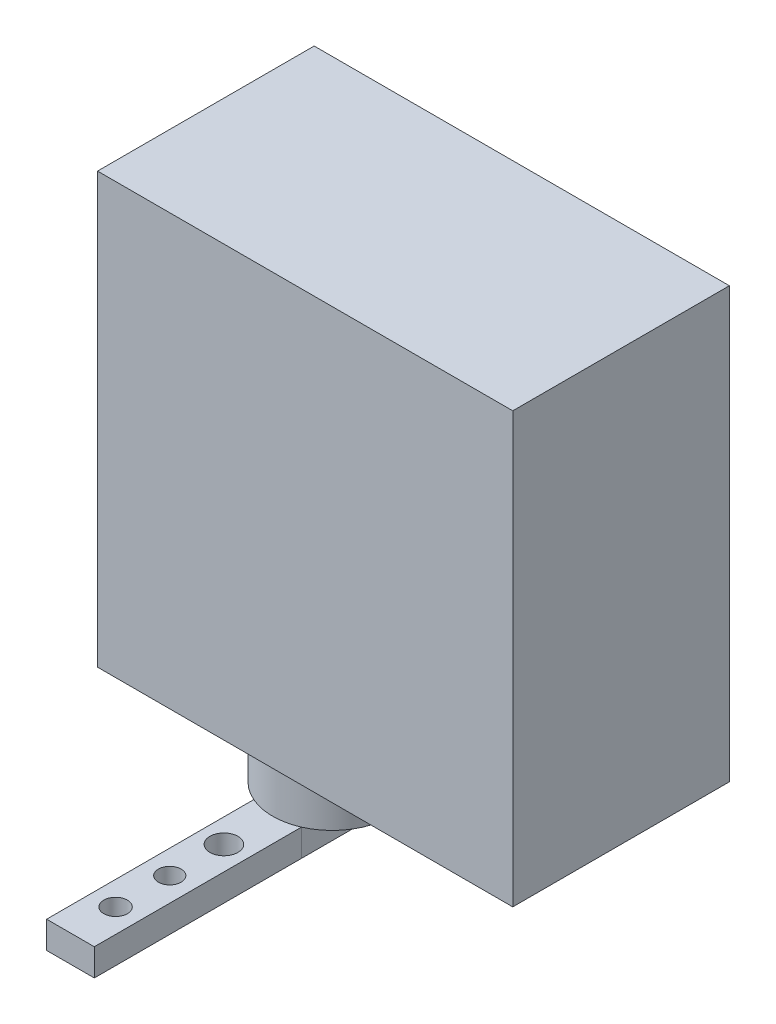
ISO-10303-21;
HEADER;
FILE_DESCRIPTION(('STEP AP214'),'2;1');
FILE_NAME('part.step','',(''),(''),'','','');
FILE_SCHEMA(('AUTOMOTIVE_DESIGN { 1 0 10303 214 1 1 1 1 }'));
ENDSEC;
DATA;
#1=APPLICATION_CONTEXT('core data for automotive mechanical design processes');
#2=APPLICATION_PROTOCOL_DEFINITION('international standard','automotive_design',2000,#1);
#3=PRODUCT_CONTEXT('',#1,'mechanical');
#4=PRODUCT('Part','Part','',(#3));
#5=PRODUCT_RELATED_PRODUCT_CATEGORY('part','',(#4));
#6=PRODUCT_DEFINITION_FORMATION('','',#4);
#7=PRODUCT_DEFINITION_CONTEXT('part definition',#1,'design');
#8=PRODUCT_DEFINITION('design','',#6,#7);
#9=PRODUCT_DEFINITION_SHAPE('','',#8);
#10=(LENGTH_UNIT() NAMED_UNIT(*) SI_UNIT(.MILLI.,.METRE.));
#11=(NAMED_UNIT(*) PLANE_ANGLE_UNIT() SI_UNIT($,.RADIAN.));
#12=(NAMED_UNIT(*) SI_UNIT($,.STERADIAN.) SOLID_ANGLE_UNIT());
#13=UNCERTAINTY_MEASURE_WITH_UNIT(LENGTH_MEASURE(1.E-05),#10,'distance_accuracy_value','');
#14=(GEOMETRIC_REPRESENTATION_CONTEXT(3) GLOBAL_UNCERTAINTY_ASSIGNED_CONTEXT((#13)) GLOBAL_UNIT_ASSIGNED_CONTEXT((#10,
#11,#12)) REPRESENTATION_CONTEXT('',''));
#15=CARTESIAN_POINT('',(0.,0.,0.));
#16=DIRECTION('',(0.,0.,1.));
#17=DIRECTION('',(1.,0.,0.));
#18=AXIS2_PLACEMENT_3D('',#15,#16,#17);
#19=CARTESIAN_POINT('',(6.99999999999999,-6.5,-6.));
#20=DIRECTION('',(0.,1.,0.));
#21=DIRECTION('',(0.,0.,1.));
#22=AXIS2_PLACEMENT_3D('',#19,#20,#21);
#23=CYLINDRICAL_SURFACE('',#22,3.30179450317333);
#24=CARTESIAN_POINT('',(6.99999999999999,-5.,-6.));
#25=DIRECTION('',(0.,-1.,0.));
#26=DIRECTION('',(0.,0.,-1.));
#27=AXIS2_PLACEMENT_3D('',#24,#25,#26);
#28=CIRCLE('',#27,3.30179450317333);
#29=CARTESIAN_POINT('',(5.67902558880153,-5.,-9.02603264128867));
#30=VERTEX_POINT('',#29);
#31=CARTESIAN_POINT('',(8.32097441119846,-5.,-9.02603264128867));
#32=VERTEX_POINT('',#31);
#33=EDGE_CURVE('E173',#30,#32,#28,.T.);
#34=ORIENTED_EDGE('',*,*,#33,.F.);
#35=DIRECTION('',(0.,1.,0.));
#36=VECTOR('',#35,1.);
#37=CARTESIAN_POINT('',(5.67902558880153,-6.5,-9.02603264128867));
#38=LINE('',#37,#36);
#39=CARTESIAN_POINT('',(5.67902558880153,-6.5,-9.02603264128867));
#40=VERTEX_POINT('',#39);
#41=EDGE_CURVE('E13',#40,#30,#38,.T.);
#42=ORIENTED_EDGE('',*,*,#41,.F.);
#43=CARTESIAN_POINT('',(6.99999999999999,-6.5,-6.));
#44=DIRECTION('',(0.,-1.,0.));
#45=DIRECTION('',(0.,0.,-1.));
#46=AXIS2_PLACEMENT_3D('',#43,#44,#45);
#47=CIRCLE('',#46,3.30179450317333);
#48=CARTESIAN_POINT('',(8.32097441119846,-6.5,-9.02603264128867));
#49=VERTEX_POINT('',#48);
#50=EDGE_CURVE('E157',#40,#49,#47,.T.);
#51=ORIENTED_EDGE('',*,*,#50,.T.);
#52=DIRECTION('',(0.,1.,0.));
#53=VECTOR('',#52,1.);
#54=CARTESIAN_POINT('',(8.32097441119846,-6.5,-9.02603264128867));
#55=LINE('',#54,#53);
#56=EDGE_CURVE('E135',#49,#32,#55,.T.);
#57=ORIENTED_EDGE('',*,*,#56,.T.);
#58=EDGE_LOOP('',(#34,#42,#51,#57));
#59=FACE_BOUND('',#58,.T.);
#60=ADVANCED_FACE('F95',(#59),#23,.F.);
#61=CARTESIAN_POINT('',(5.67902558880153,-6.5,0.));
#62=DIRECTION('',(-1.,0.,0.));
#63=DIRECTION('',(0.,0.,1.));
#64=AXIS2_PLACEMENT_3D('',#61,#62,#63);
#65=PLANE('',#64);
#66=DIRECTION('',(0.,0.,1.));
#67=VECTOR('',#66,1.);
#68=CARTESIAN_POINT('',(5.67902558880153,-5.,0.));
#69=LINE('',#68,#67);
#70=CARTESIAN_POINT('',(5.67902558880153,-5.,-20.5));
#71=VERTEX_POINT('',#70);
#72=EDGE_CURVE('E147',#71,#30,#69,.T.);
#73=ORIENTED_EDGE('',*,*,#72,.F.);
#74=DIRECTION('',(0.,1.,0.));
#75=VECTOR('',#74,1.);
#76=CARTESIAN_POINT('',(5.67902558880153,-6.5,-20.5));
#77=LINE('',#76,#75);
#78=CARTESIAN_POINT('',(5.67902558880153,-6.5,-20.5));
#79=VERTEX_POINT('',#78);
#80=EDGE_CURVE('E104',#79,#71,#77,.T.);
#81=ORIENTED_EDGE('',*,*,#80,.F.);
#82=DIRECTION('',(0.,0.,1.));
#83=VECTOR('',#82,1.);
#84=CARTESIAN_POINT('',(5.67902558880153,-6.5,0.));
#85=LINE('',#84,#83);
#86=EDGE_CURVE('E145',#79,#40,#85,.T.);
#87=ORIENTED_EDGE('',*,*,#86,.T.);
#88=ORIENTED_EDGE('',*,*,#41,.T.);
#89=EDGE_LOOP('',(#73,#81,#87,#88));
#90=FACE_BOUND('',#89,.T.);
#91=ADVANCED_FACE('F143',(#90),#65,.T.);
#92=CARTESIAN_POINT('',(0.,-6.5,-20.5));
#93=DIRECTION('',(0.,0.,1.));
#94=DIRECTION('',(1.,0.,0.));
#95=AXIS2_PLACEMENT_3D('',#92,#93,#94);
#96=PLANE('',#95);
#97=DIRECTION('',(1.,0.,0.));
#98=VECTOR('',#97,1.);
#99=CARTESIAN_POINT('',(0.,-5.,-20.5));
#100=LINE('',#99,#98);
#101=CARTESIAN_POINT('',(8.32097441119846,-5.,-20.5));
#102=VERTEX_POINT('',#101);
#103=EDGE_CURVE('E176',#71,#102,#100,.T.);
#104=ORIENTED_EDGE('',*,*,#103,.T.);
#105=DIRECTION('',(0.,1.,0.));
#106=VECTOR('',#105,1.);
#107=CARTESIAN_POINT('',(8.32097441119846,-6.5,-20.5));
#108=LINE('',#107,#106);
#109=CARTESIAN_POINT('',(8.32097441119846,-6.5,-20.5));
#110=VERTEX_POINT('',#109);
#111=EDGE_CURVE('E150',#110,#102,#108,.T.);
#112=ORIENTED_EDGE('',*,*,#111,.F.);
#113=DIRECTION('',(1.,0.,0.));
#114=VECTOR('',#113,1.);
#115=CARTESIAN_POINT('',(0.,-6.5,-20.5));
#116=LINE('',#115,#114);
#117=EDGE_CURVE('E152',#79,#110,#116,.T.);
#118=ORIENTED_EDGE('',*,*,#117,.F.);
#119=ORIENTED_EDGE('',*,*,#80,.T.);
#120=EDGE_LOOP('',(#104,#112,#118,#119));
#121=FACE_BOUND('',#120,.T.);
#122=ADVANCED_FACE('F153',(#121),#96,.F.);
#123=CARTESIAN_POINT('',(6.99999999999999,-6.5,-18.));
#124=DIRECTION('',(0.,1.,0.));
#125=DIRECTION('',(0.,0.,1.));
#126=AXIS2_PLACEMENT_3D('',#123,#124,#125);
#127=CYLINDRICAL_SURFACE('',#126,0.654535051433307);
#128=CARTESIAN_POINT('',(6.99999999999999,-6.5,-18.));
#129=DIRECTION('',(0.,-1.,0.));
#130=DIRECTION('',(0.,0.,-1.));
#131=AXIS2_PLACEMENT_3D('',#128,#129,#130);
#132=CIRCLE('',#131,0.654535051433307);
#133=CARTESIAN_POINT('',(6.99999999999999,-6.5,-18.6545350514333));
#134=VERTEX_POINT('',#133);
#135=EDGE_CURVE('E164',#134,#134,#132,.F.);
#136=ORIENTED_EDGE('',*,*,#135,.F.);
#137=EDGE_LOOP('',(#136));
#138=FACE_BOUND('',#137,.T.);
#139=CARTESIAN_POINT('',(6.99999999999999,-5.,-18.));
#140=DIRECTION('',(0.,-1.,0.));
#141=DIRECTION('',(0.,0.,-1.));
#142=AXIS2_PLACEMENT_3D('',#139,#140,#141);
#143=CIRCLE('',#142,0.654535051433307);
#144=CARTESIAN_POINT('',(6.99999999999999,-5.,-18.6545350514333));
#145=VERTEX_POINT('',#144);
#146=EDGE_CURVE('E179',#145,#145,#143,.F.);
#147=ORIENTED_EDGE('',*,*,#146,.T.);
#148=EDGE_LOOP('',(#147));
#149=FACE_BOUND('',#148,.T.);
#150=ADVANCED_FACE('F198',(#138,#149),#127,.F.);
#151=CARTESIAN_POINT('',(8.32097441119846,-6.5,0.));
#152=DIRECTION('',(-1.,0.,0.));
#153=DIRECTION('',(0.,0.,1.));
#154=AXIS2_PLACEMENT_3D('',#151,#152,#153);
#155=PLANE('',#154);
#156=DIRECTION('',(0.,0.,1.));
#157=VECTOR('',#156,1.);
#158=CARTESIAN_POINT('',(8.32097441119846,-5.,0.));
#159=LINE('',#158,#157);
#160=EDGE_CURVE('E128',#102,#32,#159,.T.);
#161=ORIENTED_EDGE('',*,*,#160,.T.);
#162=ORIENTED_EDGE('',*,*,#56,.F.);
#163=DIRECTION('',(0.,0.,1.));
#164=VECTOR('',#163,1.);
#165=CARTESIAN_POINT('',(8.32097441119846,-6.5,0.));
#166=LINE('',#165,#164);
#167=EDGE_CURVE('E112',#110,#49,#166,.T.);
#168=ORIENTED_EDGE('',*,*,#167,.F.);
#169=ORIENTED_EDGE('',*,*,#111,.T.);
#170=EDGE_LOOP('',(#161,#162,#168,#169));
#171=FACE_BOUND('',#170,.T.);
#172=ADVANCED_FACE('F187',(#171),#155,.F.);
#173=CARTESIAN_POINT('',(6.99999999999999,-6.5,-15.));
#174=DIRECTION('',(0.,1.,0.));
#175=DIRECTION('',(0.,0.,1.));
#176=AXIS2_PLACEMENT_3D('',#173,#174,#175);
#177=CYLINDRICAL_SURFACE('',#176,0.631230600063565);
#178=CARTESIAN_POINT('',(6.99999999999999,-6.5,-15.));
#179=DIRECTION('',(0.,-1.,0.));
#180=DIRECTION('',(0.,0.,-1.));
#181=AXIS2_PLACEMENT_3D('',#178,#179,#180);
#182=CIRCLE('',#181,0.631230600063565);
#183=CARTESIAN_POINT('',(6.99999999999999,-6.5,-15.6312306000636));
#184=VERTEX_POINT('',#183);
#185=EDGE_CURVE('E159',#184,#184,#182,.F.);
#186=ORIENTED_EDGE('',*,*,#185,.F.);
#187=EDGE_LOOP('',(#186));
#188=FACE_BOUND('',#187,.T.);
#189=CARTESIAN_POINT('',(6.99999999999999,-5.,-15.));
#190=DIRECTION('',(0.,-1.,0.));
#191=DIRECTION('',(0.,0.,-1.));
#192=AXIS2_PLACEMENT_3D('',#189,#190,#191);
#193=CIRCLE('',#192,0.631230600063565);
#194=CARTESIAN_POINT('',(6.99999999999999,-5.,-15.6312306000636));
#195=VERTEX_POINT('',#194);
#196=EDGE_CURVE('E170',#195,#195,#193,.F.);
#197=ORIENTED_EDGE('',*,*,#196,.T.);
#198=EDGE_LOOP('',(#197));
#199=FACE_BOUND('',#198,.T.);
#200=ADVANCED_FACE('F97',(#188,#199),#177,.F.);
#201=CARTESIAN_POINT('',(6.99999999999999,-6.5,-12.));
#202=DIRECTION('',(0.,1.,0.));
#203=DIRECTION('',(0.,0.,1.));
#204=AXIS2_PLACEMENT_3D('',#201,#202,#203);
#205=CYLINDRICAL_SURFACE('',#204,0.775607199505845);
#206=CARTESIAN_POINT('',(6.99999999999999,-6.5,-12.));
#207=DIRECTION('',(0.,-1.,0.));
#208=DIRECTION('',(0.,0.,-1.));
#209=AXIS2_PLACEMENT_3D('',#206,#207,#208);
#210=CIRCLE('',#209,0.775607199505845);
#211=CARTESIAN_POINT('',(6.99999999999999,-6.5,-12.7756071995058));
#212=VERTEX_POINT('',#211);
#213=EDGE_CURVE('E167',#212,#212,#210,.F.);
#214=ORIENTED_EDGE('',*,*,#213,.F.);
#215=EDGE_LOOP('',(#214));
#216=FACE_BOUND('',#215,.T.);
#217=CARTESIAN_POINT('',(6.99999999999999,-5.,-12.));
#218=DIRECTION('',(0.,-1.,0.));
#219=DIRECTION('',(0.,0.,-1.));
#220=AXIS2_PLACEMENT_3D('',#217,#218,#219);
#221=CIRCLE('',#220,0.775607199505845);
#222=CARTESIAN_POINT('',(6.99999999999999,-5.,-12.7756071995058));
#223=VERTEX_POINT('',#222);
#224=EDGE_CURVE('E182',#223,#223,#221,.F.);
#225=ORIENTED_EDGE('',*,*,#224,.T.);
#226=EDGE_LOOP('',(#225));
#227=FACE_BOUND('',#226,.T.);
#228=ADVANCED_FACE('F204',(#216,#227),#205,.F.);
#229=CARTESIAN_POINT('',(0.,-6.5,0.));
#230=DIRECTION('',(0.,-1.,0.));
#231=DIRECTION('',(0.,0.,-1.));
#232=AXIS2_PLACEMENT_3D('',#229,#230,#231);
#233=PLANE('',#232);
#234=ORIENTED_EDGE('',*,*,#185,.T.);
#235=EDGE_LOOP('',(#234));
#236=FACE_BOUND('',#235,.T.);
#237=ORIENTED_EDGE('',*,*,#50,.F.);
#238=ORIENTED_EDGE('',*,*,#86,.F.);
#239=ORIENTED_EDGE('',*,*,#117,.T.);
#240=ORIENTED_EDGE('',*,*,#167,.T.);
#241=EDGE_LOOP('',(#237,#238,#239,#240));
#242=FACE_BOUND('',#241,.T.);
#243=ORIENTED_EDGE('',*,*,#135,.T.);
#244=EDGE_LOOP('',(#243));
#245=FACE_BOUND('',#244,.T.);
#246=ORIENTED_EDGE('',*,*,#213,.T.);
#247=EDGE_LOOP('',(#246));
#248=FACE_BOUND('',#247,.T.);
#249=ADVANCED_FACE('F155',(#236,#242,#245,#248),#233,.T.);
#250=CARTESIAN_POINT('',(0.,-5.,0.));
#251=DIRECTION('',(0.,-1.,0.));
#252=DIRECTION('',(0.,0.,-1.));
#253=AXIS2_PLACEMENT_3D('',#250,#251,#252);
#254=PLANE('',#253);
#255=ORIENTED_EDGE('',*,*,#196,.F.);
#256=EDGE_LOOP('',(#255));
#257=FACE_BOUND('',#256,.T.);
#258=ORIENTED_EDGE('',*,*,#33,.T.);
#259=ORIENTED_EDGE('',*,*,#160,.F.);
#260=ORIENTED_EDGE('',*,*,#103,.F.);
#261=ORIENTED_EDGE('',*,*,#72,.T.);
#262=EDGE_LOOP('',(#258,#259,#260,#261));
#263=FACE_BOUND('',#262,.T.);
#264=ORIENTED_EDGE('',*,*,#146,.F.);
#265=EDGE_LOOP('',(#264));
#266=FACE_BOUND('',#265,.T.);
#267=ORIENTED_EDGE('',*,*,#224,.F.);
#268=EDGE_LOOP('',(#267));
#269=FACE_BOUND('',#268,.T.);
#270=ADVANCED_FACE('F188',(#257,#263,#266,#269),#254,.F.);
#271=CLOSED_SHELL('',(#60,#91,#122,#150,#172,#200,#228,#249,#270));
#272=MANIFOLD_SOLID_BREP('B2',#271);
#273=CARTESIAN_POINT('',(6.99999999999999,-6.5,-6.));
#274=DIRECTION('',(0.,1.,0.));
#275=DIRECTION('',(0.,0.,1.));
#276=AXIS2_PLACEMENT_3D('',#273,#274,#275);
#277=CYLINDRICAL_SURFACE('',#276,3.30179450317333);
#278=CARTESIAN_POINT('',(6.99999999999999,-5.,-6.));
#279=DIRECTION('',(0.,-1.,0.));
#280=DIRECTION('',(0.,0.,-1.));
#281=AXIS2_PLACEMENT_3D('',#278,#279,#280);
#282=CIRCLE('',#281,3.30179450317333);
#283=CARTESIAN_POINT('',(8.32097441119846,-5.,-2.97396735871133));
#284=VERTEX_POINT('',#283);
#285=CARTESIAN_POINT('',(5.67902558880153,-5.,-2.97396735871133));
#286=VERTEX_POINT('',#285);
#287=EDGE_CURVE('E363',#284,#286,#282,.T.);
#288=ORIENTED_EDGE('',*,*,#287,.F.);
#289=DIRECTION('',(0.,1.,0.));
#290=VECTOR('',#289,1.);
#291=CARTESIAN_POINT('',(8.32097441119846,-6.5,-2.97396735871133));
#292=LINE('',#291,#290);
#293=CARTESIAN_POINT('',(8.32097441119846,-6.5,-2.97396735871133));
#294=VERTEX_POINT('',#293);
#295=EDGE_CURVE('E93',#294,#284,#292,.T.);
#296=ORIENTED_EDGE('',*,*,#295,.F.);
#297=CARTESIAN_POINT('',(6.99999999999999,-6.5,-6.));
#298=DIRECTION('',(0.,-1.,0.));
#299=DIRECTION('',(0.,0.,-1.));
#300=AXIS2_PLACEMENT_3D('',#297,#298,#299);
#301=CIRCLE('',#300,3.30179450317333);
#302=CARTESIAN_POINT('',(5.67902558880153,-6.5,-2.97396735871133));
#303=VERTEX_POINT('',#302);
#304=EDGE_CURVE('E339',#294,#303,#301,.T.);
#305=ORIENTED_EDGE('',*,*,#304,.T.);
#306=DIRECTION('',(0.,1.,0.));
#307=VECTOR('',#306,1.);
#308=CARTESIAN_POINT('',(5.67902558880153,-6.5,-2.97396735871133));
#309=LINE('',#308,#307);
#310=EDGE_CURVE('E307',#303,#286,#309,.T.);
#311=ORIENTED_EDGE('',*,*,#310,.T.);
#312=EDGE_LOOP('',(#288,#296,#305,#311));
#313=FACE_BOUND('',#312,.T.);
#314=ADVANCED_FACE('F290',(#313),#277,.F.);
#315=CARTESIAN_POINT('',(8.32097441119846,-6.5,0.));
#316=DIRECTION('',(-1.,0.,0.));
#317=DIRECTION('',(0.,0.,1.));
#318=AXIS2_PLACEMENT_3D('',#315,#316,#317);
#319=PLANE('',#318);
#320=DIRECTION('',(0.,0.,1.));
#321=VECTOR('',#320,1.);
#322=CARTESIAN_POINT('',(8.32097441119846,-5.,0.));
#323=LINE('',#322,#321);
#324=CARTESIAN_POINT('',(8.32097441119846,-5.,8.5));
#325=VERTEX_POINT('',#324);
#326=EDGE_CURVE('E345',#284,#325,#323,.T.);
#327=ORIENTED_EDGE('',*,*,#326,.T.);
#328=DIRECTION('',(0.,1.,0.));
#329=VECTOR('',#328,1.);
#330=CARTESIAN_POINT('',(8.32097441119846,-6.5,8.5));
#331=LINE('',#330,#329);
#332=CARTESIAN_POINT('',(8.32097441119846,-6.5,8.5));
#333=VERTEX_POINT('',#332);
#334=EDGE_CURVE('E299',#333,#325,#331,.T.);
#335=ORIENTED_EDGE('',*,*,#334,.F.);
#336=DIRECTION('',(0.,0.,1.));
#337=VECTOR('',#336,1.);
#338=CARTESIAN_POINT('',(8.32097441119846,-6.5,0.));
#339=LINE('',#338,#337);
#340=EDGE_CURVE('E333',#294,#333,#339,.T.);
#341=ORIENTED_EDGE('',*,*,#340,.F.);
#342=ORIENTED_EDGE('',*,*,#295,.T.);
#343=EDGE_LOOP('',(#327,#335,#341,#342));
#344=FACE_BOUND('',#343,.T.);
#345=ADVANCED_FACE('F343',(#344),#319,.F.);
#346=CARTESIAN_POINT('',(0.,-6.5,8.5));
#347=DIRECTION('',(0.,0.,1.));
#348=DIRECTION('',(1.,0.,0.));
#349=AXIS2_PLACEMENT_3D('',#346,#347,#348);
#350=PLANE('',#349);
#351=DIRECTION('',(1.,0.,0.));
#352=VECTOR('',#351,1.);
#353=CARTESIAN_POINT('',(0.,-5.,8.5));
#354=LINE('',#353,#352);
#355=CARTESIAN_POINT('',(5.67902558880153,-5.,8.5));
#356=VERTEX_POINT('',#355);
#357=EDGE_CURVE('E366',#356,#325,#354,.T.);
#358=ORIENTED_EDGE('',*,*,#357,.F.);
#359=DIRECTION('',(0.,1.,0.));
#360=VECTOR('',#359,1.);
#361=CARTESIAN_POINT('',(5.67902558880153,-6.5,8.5));
#362=LINE('',#361,#360);
#363=CARTESIAN_POINT('',(5.67902558880153,-6.5,8.5));
#364=VERTEX_POINT('',#363);
#365=EDGE_CURVE('E320',#364,#356,#362,.T.);
#366=ORIENTED_EDGE('',*,*,#365,.F.);
#367=DIRECTION('',(1.,0.,0.));
#368=VECTOR('',#367,1.);
#369=CARTESIAN_POINT('',(0.,-6.5,8.5));
#370=LINE('',#369,#368);
#371=EDGE_CURVE('E338',#364,#333,#370,.T.);
#372=ORIENTED_EDGE('',*,*,#371,.T.);
#373=ORIENTED_EDGE('',*,*,#334,.T.);
#374=EDGE_LOOP('',(#358,#366,#372,#373));
#375=FACE_BOUND('',#374,.T.);
#376=ADVANCED_FACE('F348',(#375),#350,.T.);
#377=CARTESIAN_POINT('',(6.99999999999999,-6.5,0.));
#378=DIRECTION('',(0.,1.,0.));
#379=DIRECTION('',(0.,0.,1.));
#380=AXIS2_PLACEMENT_3D('',#377,#378,#379);
#381=CYLINDRICAL_SURFACE('',#380,0.775607199505845);
#382=CARTESIAN_POINT('',(6.99999999999999,-6.5,0.));
#383=DIRECTION('',(0.,-1.,0.));
#384=DIRECTION('',(0.,0.,-1.));
#385=AXIS2_PLACEMENT_3D('',#382,#383,#384);
#386=CIRCLE('',#385,0.775607199505845);
#387=CARTESIAN_POINT('',(6.99999999999999,-6.5,-0.775607199505846));
#388=VERTEX_POINT('',#387);
#389=EDGE_CURVE('E380',#388,#388,#386,.T.);
#390=ORIENTED_EDGE('',*,*,#389,.T.);
#391=EDGE_LOOP('',(#390));
#392=FACE_BOUND('',#391,.T.);
#393=CARTESIAN_POINT('',(6.99999999999999,-5.,0.));
#394=DIRECTION('',(0.,-1.,0.));
#395=DIRECTION('',(0.,0.,-1.));
#396=AXIS2_PLACEMENT_3D('',#393,#394,#395);
#397=CIRCLE('',#396,0.775607199505845);
#398=CARTESIAN_POINT('',(6.99999999999999,-5.,-0.775607199505846));
#399=VERTEX_POINT('',#398);
#400=EDGE_CURVE('E360',#399,#399,#397,.T.);
#401=ORIENTED_EDGE('',*,*,#400,.F.);
#402=EDGE_LOOP('',(#401));
#403=FACE_BOUND('',#402,.T.);
#404=ADVANCED_FACE('F404',(#392,#403),#381,.F.);
#405=CARTESIAN_POINT('',(6.99999999999999,-6.5,3.));
#406=DIRECTION('',(0.,1.,0.));
#407=DIRECTION('',(0.,0.,1.));
#408=AXIS2_PLACEMENT_3D('',#405,#406,#407);
#409=CYLINDRICAL_SURFACE('',#408,0.631230600063565);
#410=CARTESIAN_POINT('',(6.99999999999999,-6.5,3.));
#411=DIRECTION('',(0.,-1.,0.));
#412=DIRECTION('',(0.,0.,-1.));
#413=AXIS2_PLACEMENT_3D('',#410,#411,#412);
#414=CIRCLE('',#413,0.631230600063565);
#415=CARTESIAN_POINT('',(6.99999999999999,-6.5,2.36876939993644));
#416=VERTEX_POINT('',#415);
#417=EDGE_CURVE('E375',#416,#416,#414,.T.);
#418=ORIENTED_EDGE('',*,*,#417,.T.);
#419=EDGE_LOOP('',(#418));
#420=FACE_BOUND('',#419,.T.);
#421=CARTESIAN_POINT('',(6.99999999999999,-5.,3.));
#422=DIRECTION('',(0.,-1.,0.));
#423=DIRECTION('',(0.,0.,-1.));
#424=AXIS2_PLACEMENT_3D('',#421,#422,#423);
#425=CIRCLE('',#424,0.631230600063565);
#426=CARTESIAN_POINT('',(6.99999999999999,-5.,2.36876939993644));
#427=VERTEX_POINT('',#426);
#428=EDGE_CURVE('E357',#427,#427,#425,.T.);
#429=ORIENTED_EDGE('',*,*,#428,.F.);
#430=EDGE_LOOP('',(#429));
#431=FACE_BOUND('',#430,.T.);
#432=ADVANCED_FACE('F394',(#420,#431),#409,.F.);
#433=CARTESIAN_POINT('',(6.99999999999999,-6.5,6.));
#434=DIRECTION('',(0.,1.,0.));
#435=DIRECTION('',(0.,0.,1.));
#436=AXIS2_PLACEMENT_3D('',#433,#434,#435);
#437=CYLINDRICAL_SURFACE('',#436,0.654535051433307);
#438=CARTESIAN_POINT('',(6.99999999999999,-6.5,6.));
#439=DIRECTION('',(0.,-1.,0.));
#440=DIRECTION('',(0.,0.,-1.));
#441=AXIS2_PLACEMENT_3D('',#438,#439,#440);
#442=CIRCLE('',#441,0.654535051433307);
#443=CARTESIAN_POINT('',(6.99999999999999,-6.5,5.34546494856669));
#444=VERTEX_POINT('',#443);
#445=EDGE_CURVE('E371',#444,#444,#442,.T.);
#446=ORIENTED_EDGE('',*,*,#445,.T.);
#447=EDGE_LOOP('',(#446));
#448=FACE_BOUND('',#447,.T.);
#449=CARTESIAN_POINT('',(6.99999999999999,-5.,6.));
#450=DIRECTION('',(0.,-1.,0.));
#451=DIRECTION('',(0.,0.,-1.));
#452=AXIS2_PLACEMENT_3D('',#449,#450,#451);
#453=CIRCLE('',#452,0.654535051433307);
#454=CARTESIAN_POINT('',(6.99999999999999,-5.,5.34546494856669));
#455=VERTEX_POINT('',#454);
#456=EDGE_CURVE('E354',#455,#455,#453,.T.);
#457=ORIENTED_EDGE('',*,*,#456,.F.);
#458=EDGE_LOOP('',(#457));
#459=FACE_BOUND('',#458,.T.);
#460=ADVANCED_FACE('F292',(#448,#459),#437,.F.);
#461=CARTESIAN_POINT('',(5.67902558880153,-6.5,0.));
#462=DIRECTION('',(-1.,0.,0.));
#463=DIRECTION('',(0.,0.,1.));
#464=AXIS2_PLACEMENT_3D('',#461,#462,#463);
#465=PLANE('',#464);
#466=DIRECTION('',(0.,0.,1.));
#467=VECTOR('',#466,1.);
#468=CARTESIAN_POINT('',(5.67902558880153,-5.,0.));
#469=LINE('',#468,#467);
#470=EDGE_CURVE('E368',#286,#356,#469,.T.);
#471=ORIENTED_EDGE('',*,*,#470,.F.);
#472=ORIENTED_EDGE('',*,*,#310,.F.);
#473=DIRECTION('',(0.,0.,1.));
#474=VECTOR('',#473,1.);
#475=CARTESIAN_POINT('',(5.67902558880153,-6.5,0.));
#476=LINE('',#475,#474);
#477=EDGE_CURVE('E349',#303,#364,#476,.T.);
#478=ORIENTED_EDGE('',*,*,#477,.T.);
#479=ORIENTED_EDGE('',*,*,#365,.T.);
#480=EDGE_LOOP('',(#471,#472,#478,#479));
#481=FACE_BOUND('',#480,.T.);
#482=ADVANCED_FACE('F384',(#481),#465,.T.);
#483=CARTESIAN_POINT('',(0.,-6.5,0.));
#484=DIRECTION('',(0.,-1.,0.));
#485=DIRECTION('',(0.,0.,-1.));
#486=AXIS2_PLACEMENT_3D('',#483,#484,#485);
#487=PLANE('',#486);
#488=ORIENTED_EDGE('',*,*,#445,.F.);
#489=EDGE_LOOP('',(#488));
#490=FACE_BOUND('',#489,.T.);
#491=ORIENTED_EDGE('',*,*,#417,.F.);
#492=EDGE_LOOP('',(#491));
#493=FACE_BOUND('',#492,.T.);
#494=ORIENTED_EDGE('',*,*,#389,.F.);
#495=EDGE_LOOP('',(#494));
#496=FACE_BOUND('',#495,.T.);
#497=ORIENTED_EDGE('',*,*,#304,.F.);
#498=ORIENTED_EDGE('',*,*,#340,.T.);
#499=ORIENTED_EDGE('',*,*,#371,.F.);
#500=ORIENTED_EDGE('',*,*,#477,.F.);
#501=EDGE_LOOP('',(#497,#498,#499,#500));
#502=FACE_BOUND('',#501,.T.);
#503=ADVANCED_FACE('F335',(#490,#493,#496,#502),#487,.T.);
#504=CARTESIAN_POINT('',(0.,-5.,0.));
#505=DIRECTION('',(0.,-1.,0.));
#506=DIRECTION('',(0.,0.,-1.));
#507=AXIS2_PLACEMENT_3D('',#504,#505,#506);
#508=PLANE('',#507);
#509=ORIENTED_EDGE('',*,*,#456,.T.);
#510=EDGE_LOOP('',(#509));
#511=FACE_BOUND('',#510,.T.);
#512=ORIENTED_EDGE('',*,*,#428,.T.);
#513=EDGE_LOOP('',(#512));
#514=FACE_BOUND('',#513,.T.);
#515=ORIENTED_EDGE('',*,*,#400,.T.);
#516=EDGE_LOOP('',(#515));
#517=FACE_BOUND('',#516,.T.);
#518=ORIENTED_EDGE('',*,*,#287,.T.);
#519=ORIENTED_EDGE('',*,*,#470,.T.);
#520=ORIENTED_EDGE('',*,*,#357,.T.);
#521=ORIENTED_EDGE('',*,*,#326,.F.);
#522=EDGE_LOOP('',(#518,#519,#520,#521));
#523=FACE_BOUND('',#522,.T.);
#524=ADVANCED_FACE('F391',(#511,#514,#517,#523),#508,.F.);
#525=CLOSED_SHELL('',(#314,#345,#376,#404,#432,#460,#482,#503,#524));
#526=MANIFOLD_SOLID_BREP('B7',#525);
#527=CARTESIAN_POINT('',(6.99999999999999,-5.,-6.));
#528=DIRECTION('',(0.,-1.,0.));
#529=DIRECTION('',(0.,0.,-1.));
#530=AXIS2_PLACEMENT_3D('',#527,#528,#529);
#531=PLANE('',#530);
#532=CARTESIAN_POINT('',(6.99999999999999,-5.,-6.));
#533=DIRECTION('',(0.,-1.,0.));
#534=DIRECTION('',(0.,0.,-1.));
#535=AXIS2_PLACEMENT_3D('',#532,#533,#534);
#536=CIRCLE('',#535,3.3);
#537=CARTESIAN_POINT('',(5.67902558880153,-5.,-2.97592549612962));
#538=VERTEX_POINT('',#537);
#539=CARTESIAN_POINT('',(5.67902558880153,-5.,-9.02407450387038));
#540=VERTEX_POINT('',#539);
#541=EDGE_CURVE('E490',#538,#540,#536,.T.);
#542=ORIENTED_EDGE('',*,*,#541,.T.);
#543=DIRECTION('',(0.,0.,1.));
#544=VECTOR('',#543,1.);
#545=CARTESIAN_POINT('',(5.67902558880153,-5.,0.));
#546=LINE('',#545,#544);
#547=EDGE_CURVE('E494',#540,#538,#546,.T.);
#548=ORIENTED_EDGE('',*,*,#547,.T.);
#549=EDGE_LOOP('',(#542,#548));
#550=FACE_BOUND('',#549,.T.);
#551=ADVANCED_FACE('F476',(#550),#531,.T.);
#552=CARTESIAN_POINT('',(0.,23.8,0.));
#553=DIRECTION('',(1.,0.,0.));
#554=DIRECTION('',(0.,0.,-1.));
#555=AXIS2_PLACEMENT_3D('',#552,#553,#554);
#556=PLANE('',#555);
#557=DIRECTION('',(0.,0.,1.));
#558=VECTOR('',#557,1.);
#559=CARTESIAN_POINT('',(0.,0.,0.));
#560=LINE('',#559,#558);
#561=CARTESIAN_POINT('',(0.,0.,-12.));
#562=VERTEX_POINT('',#561);
#563=CARTESIAN_POINT('',(0.,0.,0.));
#564=VERTEX_POINT('',#563);
#565=EDGE_CURVE('E578',#562,#564,#560,.T.);
#566=ORIENTED_EDGE('',*,*,#565,.T.);
#567=DIRECTION('',(0.,-1.,0.));
#568=VECTOR('',#567,1.);
#569=CARTESIAN_POINT('',(0.,23.8,0.));
#570=LINE('',#569,#568);
#571=CARTESIAN_POINT('',(0.,23.8,0.));
#572=VERTEX_POINT('',#571);
#573=EDGE_CURVE('E288',#572,#564,#570,.T.);
#574=ORIENTED_EDGE('',*,*,#573,.F.);
#575=DIRECTION('',(0.,0.,1.));
#576=VECTOR('',#575,1.);
#577=CARTESIAN_POINT('',(0.,23.8,0.));
#578=LINE('',#577,#576);
#579=CARTESIAN_POINT('',(0.,23.8,-12.));
#580=VERTEX_POINT('',#579);
#581=EDGE_CURVE('E581',#580,#572,#578,.T.);
#582=ORIENTED_EDGE('',*,*,#581,.F.);
#583=DIRECTION('',(0.,-1.,0.));
#584=VECTOR('',#583,1.);
#585=CARTESIAN_POINT('',(0.,23.8,-12.));
#586=LINE('',#585,#584);
#587=EDGE_CURVE('E591',#580,#562,#586,.T.);
#588=ORIENTED_EDGE('',*,*,#587,.T.);
#589=EDGE_LOOP('',(#566,#574,#582,#588));
#590=FACE_BOUND('',#589,.T.);
#591=ADVANCED_FACE('F478',(#590),#556,.F.);
#592=CARTESIAN_POINT('',(0.,23.8,0.));
#593=DIRECTION('',(0.,0.,-1.));
#594=DIRECTION('',(-1.,0.,0.));
#595=AXIS2_PLACEMENT_3D('',#592,#593,#594);
#596=PLANE('',#595);
#597=DIRECTION('',(1.,0.,0.));
#598=VECTOR('',#597,1.);
#599=CARTESIAN_POINT('',(0.,0.,0.));
#600=LINE('',#599,#598);
#601=CARTESIAN_POINT('',(23.,0.,0.));
#602=VERTEX_POINT('',#601);
#603=EDGE_CURVE('E594',#564,#602,#600,.T.);
#604=ORIENTED_EDGE('',*,*,#603,.T.);
#605=DIRECTION('',(0.,-1.,0.));
#606=VECTOR('',#605,1.);
#607=CARTESIAN_POINT('',(23.,23.8,0.));
#608=LINE('',#607,#606);
#609=CARTESIAN_POINT('',(23.,23.8,0.));
#610=VERTEX_POINT('',#609);
#611=EDGE_CURVE('E484',#610,#602,#608,.T.);
#612=ORIENTED_EDGE('',*,*,#611,.F.);
#613=DIRECTION('',(1.,0.,0.));
#614=VECTOR('',#613,1.);
#615=CARTESIAN_POINT('',(0.,23.8,0.));
#616=LINE('',#615,#614);
#617=EDGE_CURVE('E584',#572,#610,#616,.T.);
#618=ORIENTED_EDGE('',*,*,#617,.F.);
#619=ORIENTED_EDGE('',*,*,#573,.T.);
#620=EDGE_LOOP('',(#604,#612,#618,#619));
#621=FACE_BOUND('',#620,.T.);
#622=ADVANCED_FACE('F624',(#621),#596,.F.);
#623=CARTESIAN_POINT('',(23.,23.8,0.));
#624=DIRECTION('',(-1.,0.,0.));
#625=DIRECTION('',(0.,0.,1.));
#626=AXIS2_PLACEMENT_3D('',#623,#624,#625);
#627=PLANE('',#626);
#628=DIRECTION('',(0.,0.,-1.));
#629=VECTOR('',#628,1.);
#630=CARTESIAN_POINT('',(23.,0.,0.));
#631=LINE('',#630,#629);
#632=CARTESIAN_POINT('',(23.,0.,-12.));
#633=VERTEX_POINT('',#632);
#634=EDGE_CURVE('E596',#602,#633,#631,.T.);
#635=ORIENTED_EDGE('',*,*,#634,.T.);
#636=DIRECTION('',(0.,-1.,0.));
#637=VECTOR('',#636,1.);
#638=CARTESIAN_POINT('',(23.,23.8,-12.));
#639=LINE('',#638,#637);
#640=CARTESIAN_POINT('',(23.,23.8,-12.));
#641=VERTEX_POINT('',#640);
#642=EDGE_CURVE('E601',#641,#633,#639,.T.);
#643=ORIENTED_EDGE('',*,*,#642,.F.);
#644=DIRECTION('',(0.,0.,-1.));
#645=VECTOR('',#644,1.);
#646=CARTESIAN_POINT('',(23.,23.8,0.));
#647=LINE('',#646,#645);
#648=EDGE_CURVE('E587',#610,#641,#647,.T.);
#649=ORIENTED_EDGE('',*,*,#648,.F.);
#650=ORIENTED_EDGE('',*,*,#611,.T.);
#651=EDGE_LOOP('',(#635,#643,#649,#650));
#652=FACE_BOUND('',#651,.T.);
#653=ADVANCED_FACE('F608',(#652),#627,.F.);
#654=CARTESIAN_POINT('',(0.,23.8,-12.));
#655=DIRECTION('',(0.,0.,1.));
#656=DIRECTION('',(1.,0.,0.));
#657=AXIS2_PLACEMENT_3D('',#654,#655,#656);
#658=PLANE('',#657);
#659=DIRECTION('',(-1.,0.,0.));
#660=VECTOR('',#659,1.);
#661=CARTESIAN_POINT('',(0.,0.,-12.));
#662=LINE('',#661,#660);
#663=EDGE_CURVE('E585',#633,#562,#662,.T.);
#664=ORIENTED_EDGE('',*,*,#663,.T.);
#665=ORIENTED_EDGE('',*,*,#587,.F.);
#666=DIRECTION('',(-1.,0.,0.));
#667=VECTOR('',#666,1.);
#668=CARTESIAN_POINT('',(0.,23.8,-12.));
#669=LINE('',#668,#667);
#670=EDGE_CURVE('E589',#641,#580,#669,.T.);
#671=ORIENTED_EDGE('',*,*,#670,.F.);
#672=ORIENTED_EDGE('',*,*,#642,.T.);
#673=EDGE_LOOP('',(#664,#665,#671,#672));
#674=FACE_BOUND('',#673,.T.);
#675=ADVANCED_FACE('F617',(#674),#658,.F.);
#676=CARTESIAN_POINT('',(0.,23.8,0.));
#677=DIRECTION('',(0.,-1.,0.));
#678=DIRECTION('',(0.,0.,-1.));
#679=AXIS2_PLACEMENT_3D('',#676,#677,#678);
#680=PLANE('',#679);
#681=ORIENTED_EDGE('',*,*,#581,.T.);
#682=ORIENTED_EDGE('',*,*,#617,.T.);
#683=ORIENTED_EDGE('',*,*,#648,.T.);
#684=ORIENTED_EDGE('',*,*,#670,.T.);
#685=EDGE_LOOP('',(#681,#682,#683,#684));
#686=FACE_BOUND('',#685,.T.);
#687=ADVANCED_FACE('F623',(#686),#680,.F.);
#688=CARTESIAN_POINT('',(0.,0.,0.));
#689=DIRECTION('',(0.,-1.,0.));
#690=DIRECTION('',(0.,0.,-1.));
#691=AXIS2_PLACEMENT_3D('',#688,#689,#690);
#692=PLANE('',#691);
#693=CARTESIAN_POINT('',(6.99999999999999,0.,-6.));
#694=DIRECTION('',(0.,-1.,0.));
#695=DIRECTION('',(0.,0.,-1.));
#696=AXIS2_PLACEMENT_3D('',#693,#694,#695);
#697=CIRCLE('',#696,3.3);
#698=CARTESIAN_POINT('',(6.99999999999999,0.,-9.3));
#699=VERTEX_POINT('',#698);
#700=EDGE_CURVE('E545',#699,#699,#697,.T.);
#701=ORIENTED_EDGE('',*,*,#700,.F.);
#702=EDGE_LOOP('',(#701));
#703=FACE_BOUND('',#702,.T.);
#704=ORIENTED_EDGE('',*,*,#565,.F.);
#705=ORIENTED_EDGE('',*,*,#663,.F.);
#706=ORIENTED_EDGE('',*,*,#634,.F.);
#707=ORIENTED_EDGE('',*,*,#603,.F.);
#708=EDGE_LOOP('',(#704,#705,#706,#707));
#709=FACE_BOUND('',#708,.T.);
#710=ADVANCED_FACE('F614',(#703,#709),#692,.T.);
#711=CARTESIAN_POINT('',(6.99999999999999,-5.,-6.));
#712=DIRECTION('',(0.,1.,0.));
#713=DIRECTION('',(0.,0.,1.));
#714=AXIS2_PLACEMENT_3D('',#711,#712,#713);
#715=CYLINDRICAL_SURFACE('',#714,3.3);
#716=CARTESIAN_POINT('',(8.32097441119846,-5.,-9.02407450387038));
#717=VERTEX_POINT('',#716);
#718=CARTESIAN_POINT('',(8.32097441119846,-5.,-2.97592549612962));
#719=VERTEX_POINT('',#718);
#720=EDGE_CURVE('E576',#717,#719,#536,.T.);
#721=ORIENTED_EDGE('',*,*,#720,.F.);
#722=DIRECTION('',(0.,1.,0.));
#723=VECTOR('',#722,1.);
#724=CARTESIAN_POINT('',(8.32097441119846,-6.5,-9.02407450387038));
#725=LINE('',#724,#723);
#726=CARTESIAN_POINT('',(8.32097441119846,-6.5,-9.02407450387038));
#727=VERTEX_POINT('',#726);
#728=EDGE_CURVE('E546',#727,#717,#725,.T.);
#729=ORIENTED_EDGE('',*,*,#728,.F.);
#730=CARTESIAN_POINT('',(6.99999999999999,-6.5,-6.));
#731=DIRECTION('',(0.,-1.,0.));
#732=DIRECTION('',(0.,0.,-1.));
#733=AXIS2_PLACEMENT_3D('',#730,#731,#732);
#734=CIRCLE('',#733,3.3);
#735=CARTESIAN_POINT('',(5.67902558880153,-6.5,-9.02407450387038));
#736=VERTEX_POINT('',#735);
#737=EDGE_CURVE('E549',#736,#727,#734,.T.);
#738=ORIENTED_EDGE('',*,*,#737,.F.);
#739=DIRECTION('',(0.,1.,0.));
#740=VECTOR('',#739,1.);
#741=CARTESIAN_POINT('',(5.67902558880153,-6.5,-9.02407450387038));
#742=LINE('',#741,#740);
#743=EDGE_CURVE('E538',#736,#540,#742,.T.);
#744=ORIENTED_EDGE('',*,*,#743,.T.);
#745=ORIENTED_EDGE('',*,*,#541,.F.);
#746=DIRECTION('',(0.,1.,0.));
#747=VECTOR('',#746,1.);
#748=CARTESIAN_POINT('',(5.67902558880153,-6.5,-2.97592549612962));
#749=LINE('',#748,#747);
#750=CARTESIAN_POINT('',(5.67902558880153,-6.5,-2.97592549612962));
#751=VERTEX_POINT('',#750);
#752=EDGE_CURVE('E569',#751,#538,#749,.T.);
#753=ORIENTED_EDGE('',*,*,#752,.F.);
#754=CARTESIAN_POINT('',(6.99999999999999,-6.5,-6.));
#755=DIRECTION('',(0.,-1.,0.));
#756=DIRECTION('',(0.,0.,-1.));
#757=AXIS2_PLACEMENT_3D('',#754,#755,#756);
#758=CIRCLE('',#757,3.3);
#759=CARTESIAN_POINT('',(8.32097441119846,-6.5,-2.97592549612962));
#760=VERTEX_POINT('',#759);
#761=EDGE_CURVE('E560',#760,#751,#758,.T.);
#762=ORIENTED_EDGE('',*,*,#761,.F.);
#763=DIRECTION('',(0.,1.,0.));
#764=VECTOR('',#763,1.);
#765=CARTESIAN_POINT('',(8.32097441119846,-6.5,-2.97592549612962));
#766=LINE('',#765,#764);
#767=EDGE_CURVE('E572',#760,#719,#766,.T.);
#768=ORIENTED_EDGE('',*,*,#767,.T.);
#769=EDGE_LOOP('',(#721,#729,#738,#744,#745,#753,#762,#768));
#770=FACE_BOUND('',#769,.T.);
#771=ORIENTED_EDGE('',*,*,#700,.T.);
#772=EDGE_LOOP('',(#771));
#773=FACE_BOUND('',#772,.T.);
#774=ADVANCED_FACE('F551',(#770,#773),#715,.T.);
#775=DIRECTION('',(0.,0.,1.));
#776=VECTOR('',#775,1.);
#777=CARTESIAN_POINT('',(8.32097441119846,-5.,0.));
#778=LINE('',#777,#776);
#779=EDGE_CURVE('E562',#717,#719,#778,.T.);
#780=ORIENTED_EDGE('',*,*,#779,.F.);
#781=ORIENTED_EDGE('',*,*,#720,.T.);
#782=EDGE_LOOP('',(#780,#781));
#783=FACE_BOUND('',#782,.T.);
#784=ADVANCED_FACE('F633',(#783),#531,.T.);
#785=CARTESIAN_POINT('',(5.67902558880153,-6.5,0.));
#786=DIRECTION('',(-1.,0.,0.));
#787=DIRECTION('',(0.,0.,1.));
#788=AXIS2_PLACEMENT_3D('',#785,#786,#787);
#789=PLANE('',#788);
#790=ORIENTED_EDGE('',*,*,#547,.F.);
#791=ORIENTED_EDGE('',*,*,#743,.F.);
#792=DIRECTION('',(0.,0.,1.));
#793=VECTOR('',#792,1.);
#794=CARTESIAN_POINT('',(5.67902558880153,-6.5,0.));
#795=LINE('',#794,#793);
#796=EDGE_CURVE('E543',#736,#751,#795,.T.);
#797=ORIENTED_EDGE('',*,*,#796,.T.);
#798=ORIENTED_EDGE('',*,*,#752,.T.);
#799=EDGE_LOOP('',(#790,#791,#797,#798));
#800=FACE_BOUND('',#799,.T.);
#801=ADVANCED_FACE('F540',(#800),#789,.T.);
#802=CARTESIAN_POINT('',(8.32097441119846,-6.5,0.));
#803=DIRECTION('',(-1.,0.,0.));
#804=DIRECTION('',(0.,0.,1.));
#805=AXIS2_PLACEMENT_3D('',#802,#803,#804);
#806=PLANE('',#805);
#807=ORIENTED_EDGE('',*,*,#779,.T.);
#808=ORIENTED_EDGE('',*,*,#767,.F.);
#809=DIRECTION('',(0.,0.,1.));
#810=VECTOR('',#809,1.);
#811=CARTESIAN_POINT('',(8.32097441119846,-6.5,0.));
#812=LINE('',#811,#810);
#813=EDGE_CURVE('E556',#727,#760,#812,.T.);
#814=ORIENTED_EDGE('',*,*,#813,.F.);
#815=ORIENTED_EDGE('',*,*,#728,.T.);
#816=EDGE_LOOP('',(#807,#808,#814,#815));
#817=FACE_BOUND('',#816,.T.);
#818=ADVANCED_FACE('F644',(#817),#806,.F.);
#819=CARTESIAN_POINT('',(0.,-6.5,0.));
#820=DIRECTION('',(0.,-1.,0.));
#821=DIRECTION('',(0.,0.,-1.));
#822=AXIS2_PLACEMENT_3D('',#819,#820,#821);
#823=PLANE('',#822);
#824=ORIENTED_EDGE('',*,*,#796,.F.);
#825=ORIENTED_EDGE('',*,*,#737,.T.);
#826=ORIENTED_EDGE('',*,*,#813,.T.);
#827=ORIENTED_EDGE('',*,*,#761,.T.);
#828=EDGE_LOOP('',(#824,#825,#826,#827));
#829=FACE_BOUND('',#828,.T.);
#830=ADVANCED_FACE('F558',(#829),#823,.T.);
#831=CLOSED_SHELL('',(#551,#591,#622,#653,#675,#687,#710,#774,#784,#801,#818,#830));
#832=MANIFOLD_SOLID_BREP('B87',#831);
#833=ADVANCED_BREP_SHAPE_REPRESENTATION('',(#18,#272,#526,#832),#14);
#834=SHAPE_DEFINITION_REPRESENTATION(#9,#833);
ENDSEC;
END-ISO-10303-21;
